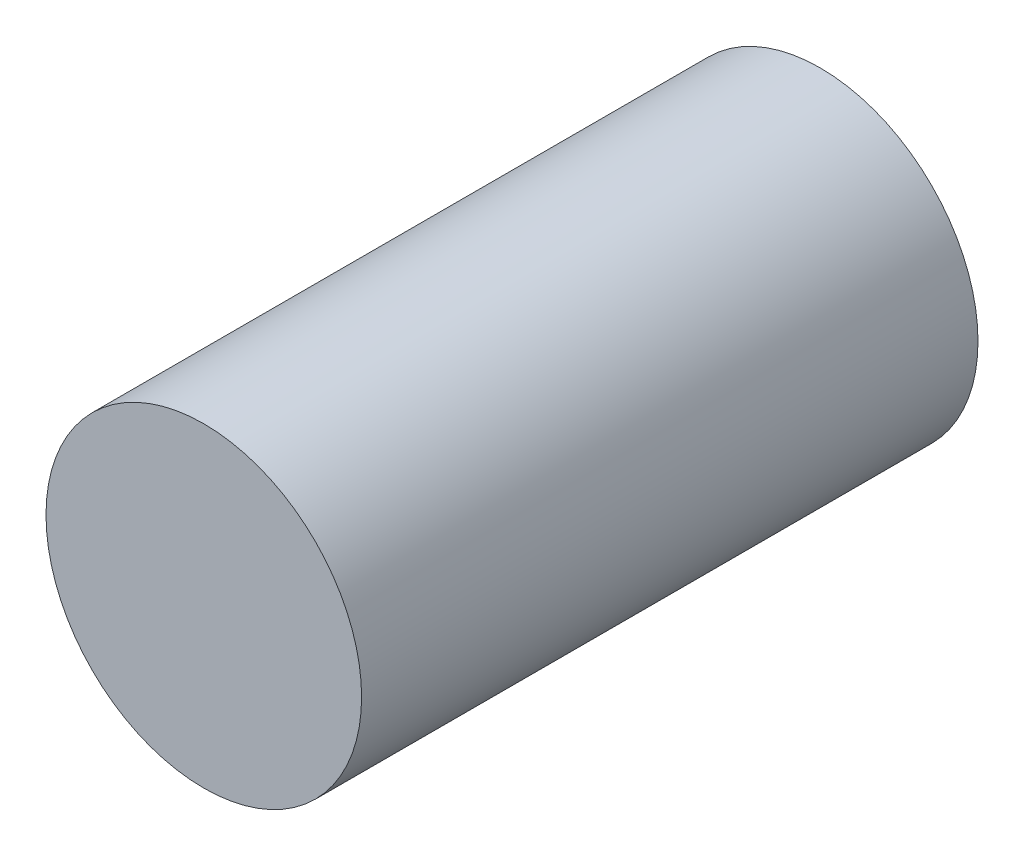
ISO-10303-21;
HEADER;
FILE_DESCRIPTION(('STEP AP214'),'2;1');
FILE_NAME('part.step','',(''),(''),'','','');
FILE_SCHEMA(('AUTOMOTIVE_DESIGN { 1 0 10303 214 1 1 1 1 }'));
ENDSEC;
DATA;
#1=APPLICATION_CONTEXT('core data for automotive mechanical design processes');
#2=APPLICATION_PROTOCOL_DEFINITION('international standard','automotive_design',2000,#1);
#3=PRODUCT_CONTEXT('',#1,'mechanical');
#4=PRODUCT('Part','Part','',(#3));
#5=PRODUCT_RELATED_PRODUCT_CATEGORY('part','',(#4));
#6=PRODUCT_DEFINITION_FORMATION('','',#4);
#7=PRODUCT_DEFINITION_CONTEXT('part definition',#1,'design');
#8=PRODUCT_DEFINITION('design','',#6,#7);
#9=PRODUCT_DEFINITION_SHAPE('','',#8);
#10=(LENGTH_UNIT() NAMED_UNIT(*) SI_UNIT(.MILLI.,.METRE.));
#11=(NAMED_UNIT(*) PLANE_ANGLE_UNIT() SI_UNIT($,.RADIAN.));
#12=(NAMED_UNIT(*) SI_UNIT($,.STERADIAN.) SOLID_ANGLE_UNIT());
#13=UNCERTAINTY_MEASURE_WITH_UNIT(LENGTH_MEASURE(1.E-05),#10,'distance_accuracy_value','');
#14=(GEOMETRIC_REPRESENTATION_CONTEXT(3) GLOBAL_UNCERTAINTY_ASSIGNED_CONTEXT((#13)) GLOBAL_UNIT_ASSIGNED_CONTEXT((#10,
#11,#12)) REPRESENTATION_CONTEXT('',''));
#15=CARTESIAN_POINT('',(0.,0.,0.));
#16=DIRECTION('',(0.,0.,1.));
#17=DIRECTION('',(1.,0.,0.));
#18=AXIS2_PLACEMENT_3D('',#15,#16,#17);
#19=CARTESIAN_POINT('',(0.,0.,18.75));
#20=DIRECTION('',(0.,0.,-1.));
#21=DIRECTION('',(-1.,0.,0.));
#22=AXIS2_PLACEMENT_3D('',#19,#20,#21);
#23=CYLINDRICAL_SURFACE('',#22,6.4);
#24=CARTESIAN_POINT('',(0.,0.,18.75));
#25=DIRECTION('',(0.,0.,1.));
#26=DIRECTION('',(1.,0.,0.));
#27=AXIS2_PLACEMENT_3D('',#24,#25,#26);
#28=CIRCLE('',#27,6.4);
#29=CARTESIAN_POINT('',(6.4,0.,18.75));
#30=VERTEX_POINT('',#29);
#31=EDGE_CURVE('E10',#30,#30,#28,.T.);
#32=ORIENTED_EDGE('',*,*,#31,.F.);
#33=EDGE_LOOP('',(#32));
#34=FACE_BOUND('',#33,.T.);
#35=CARTESIAN_POINT('',(0.,0.,-6.25));
#36=DIRECTION('',(0.,0.,1.));
#37=DIRECTION('',(1.,0.,0.));
#38=AXIS2_PLACEMENT_3D('',#35,#36,#37);
#39=CIRCLE('',#38,6.4);
#40=CARTESIAN_POINT('',(6.4,0.,-6.25));
#41=VERTEX_POINT('',#40);
#42=EDGE_CURVE('E36',#41,#41,#39,.T.);
#43=ORIENTED_EDGE('',*,*,#42,.T.);
#44=EDGE_LOOP('',(#43));
#45=FACE_BOUND('',#44,.T.);
#46=ADVANCED_FACE('F33',(#34,#45),#23,.T.);
#47=CARTESIAN_POINT('',(0.,0.,18.75));
#48=DIRECTION('',(0.,0.,1.));
#49=DIRECTION('',(1.,0.,0.));
#50=AXIS2_PLACEMENT_3D('',#47,#48,#49);
#51=PLANE('',#50);
#52=ORIENTED_EDGE('',*,*,#31,.T.);
#53=EDGE_LOOP('',(#52));
#54=FACE_BOUND('',#53,.T.);
#55=ADVANCED_FACE('F48',(#54),#51,.T.);
#56=CARTESIAN_POINT('',(0.,0.,-6.25));
#57=DIRECTION('',(0.,0.,1.));
#58=DIRECTION('',(1.,0.,0.));
#59=AXIS2_PLACEMENT_3D('',#56,#57,#58);
#60=PLANE('',#59);
#61=ORIENTED_EDGE('',*,*,#42,.F.);
#62=EDGE_LOOP('',(#61));
#63=FACE_BOUND('',#62,.T.);
#64=ADVANCED_FACE('F46',(#63),#60,.F.);
#65=CLOSED_SHELL('',(#46,#55,#64));
#66=MANIFOLD_SOLID_BREP('B2',#65);
#67=ADVANCED_BREP_SHAPE_REPRESENTATION('',(#18,#66),#14);
#68=SHAPE_DEFINITION_REPRESENTATION(#9,#67);
ENDSEC;
END-ISO-10303-21;
